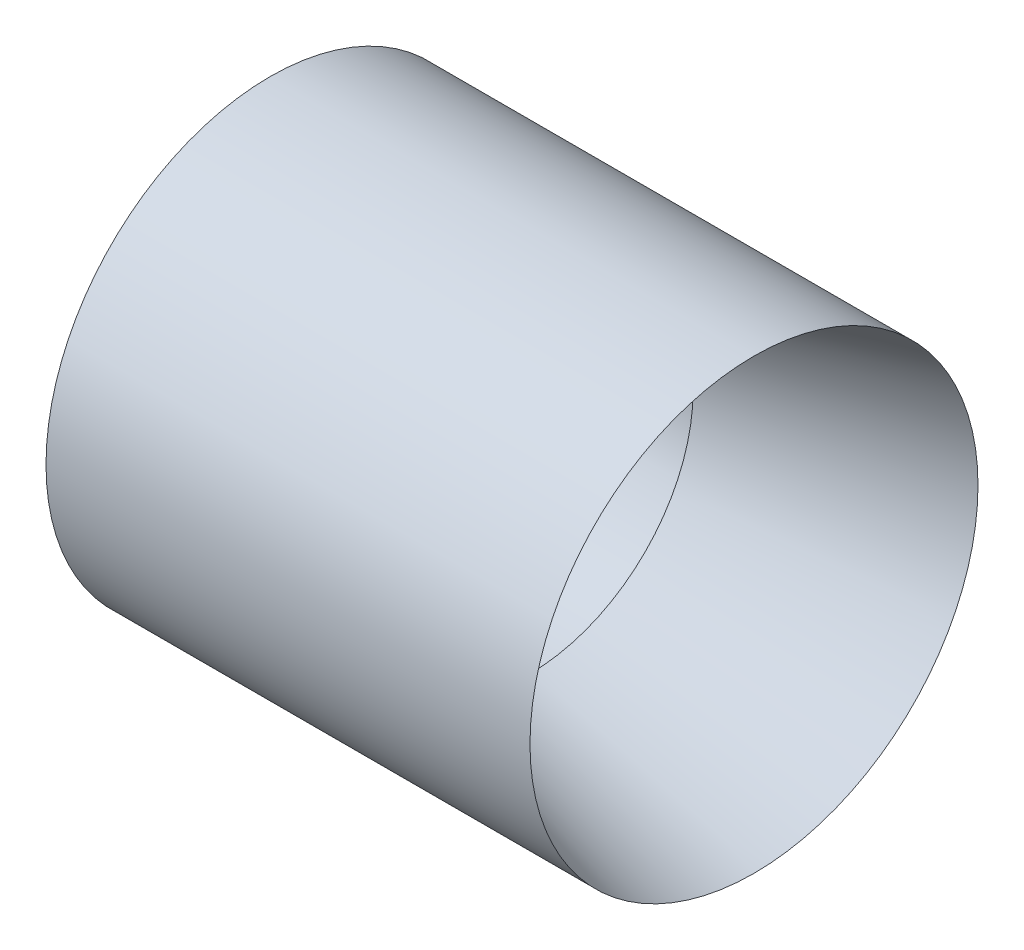
ISO-10303-21;
HEADER;
FILE_DESCRIPTION(('STEP AP214'),'2;1');
FILE_NAME('part.step','',(''),(''),'','','');
FILE_SCHEMA(('AUTOMOTIVE_DESIGN { 1 0 10303 214 1 1 1 1 }'));
ENDSEC;
DATA;
#1=APPLICATION_CONTEXT('core data for automotive mechanical design processes');
#2=APPLICATION_PROTOCOL_DEFINITION('international standard','automotive_design',2000,#1);
#3=PRODUCT_CONTEXT('',#1,'mechanical');
#4=PRODUCT('Part','Part','',(#3));
#5=PRODUCT_RELATED_PRODUCT_CATEGORY('part','',(#4));
#6=PRODUCT_DEFINITION_FORMATION('','',#4);
#7=PRODUCT_DEFINITION_CONTEXT('part definition',#1,'design');
#8=PRODUCT_DEFINITION('design','',#6,#7);
#9=PRODUCT_DEFINITION_SHAPE('','',#8);
#10=(LENGTH_UNIT() NAMED_UNIT(*) SI_UNIT(.MILLI.,.METRE.));
#11=(NAMED_UNIT(*) PLANE_ANGLE_UNIT() SI_UNIT($,.RADIAN.));
#12=(NAMED_UNIT(*) SI_UNIT($,.STERADIAN.) SOLID_ANGLE_UNIT());
#13=UNCERTAINTY_MEASURE_WITH_UNIT(LENGTH_MEASURE(1.E-05),#10,'distance_accuracy_value','');
#14=(GEOMETRIC_REPRESENTATION_CONTEXT(3) GLOBAL_UNCERTAINTY_ASSIGNED_CONTEXT((#13)) GLOBAL_UNIT_ASSIGNED_CONTEXT((#10,
#11,#12)) REPRESENTATION_CONTEXT('',''));
#15=CARTESIAN_POINT('',(0.,0.,0.));
#16=DIRECTION('',(0.,0.,1.));
#17=DIRECTION('',(1.,0.,0.));
#18=AXIS2_PLACEMENT_3D('',#15,#16,#17);
#19=CARTESIAN_POINT('',(160.657513694365,0.,0.));
#20=DIRECTION('',(-1.,0.,0.));
#21=DIRECTION('',(0.,0.,1.));
#22=AXIS2_PLACEMENT_3D('',#19,#20,#21);
#23=CONICAL_SURFACE('',#22,26.05,0.610865238198009);
#24=CARTESIAN_POINT('',(170.65454974156,0.,0.));
#25=DIRECTION('',(-1.,0.,0.));
#26=DIRECTION('',(0.,0.,1.));
#27=AXIS2_PLACEMENT_3D('',#24,#25,#26);
#28=CIRCLE('',#27,19.05);
#29=CARTESIAN_POINT('',(170.65454974156,0.,19.05));
#30=VERTEX_POINT('',#29);
#31=EDGE_CURVE('E10',#30,#30,#28,.T.);
#32=ORIENTED_EDGE('',*,*,#31,.F.);
#33=EDGE_LOOP('',(#32));
#34=FACE_BOUND('',#33,.T.);
#35=CARTESIAN_POINT('',(160.657513694365,0.,0.));
#36=DIRECTION('',(-1.,0.,0.));
#37=DIRECTION('',(0.,0.,1.));
#38=AXIS2_PLACEMENT_3D('',#35,#36,#37);
#39=CIRCLE('',#38,26.05);
#40=CARTESIAN_POINT('',(160.657513694365,0.,26.05));
#41=VERTEX_POINT('',#40);
#42=EDGE_CURVE('E51',#41,#41,#39,.T.);
#43=ORIENTED_EDGE('',*,*,#42,.T.);
#44=EDGE_LOOP('',(#43));
#45=FACE_BOUND('',#44,.T.);
#46=ADVANCED_FACE('F37',(#34,#45),#23,.F.);
#47=CARTESIAN_POINT('',(0.,0.,0.));
#48=DIRECTION('',(-1.,0.,0.));
#49=DIRECTION('',(0.,0.,1.));
#50=AXIS2_PLACEMENT_3D('',#47,#48,#49);
#51=CYLINDRICAL_SURFACE('',#50,19.05);
#52=CARTESIAN_POINT('',(190.812772909454,0.,0.));
#53=DIRECTION('',(-1.,0.,0.));
#54=DIRECTION('',(0.,0.,1.));
#55=AXIS2_PLACEMENT_3D('',#52,#53,#54);
#56=CIRCLE('',#55,19.05);
#57=CARTESIAN_POINT('',(190.812772909454,0.,19.05));
#58=VERTEX_POINT('',#57);
#59=EDGE_CURVE('E43',#58,#58,#56,.T.);
#60=ORIENTED_EDGE('',*,*,#59,.F.);
#61=EDGE_LOOP('',(#60));
#62=FACE_BOUND('',#61,.T.);
#63=ORIENTED_EDGE('',*,*,#31,.T.);
#64=EDGE_LOOP('',(#63));
#65=FACE_BOUND('',#64,.T.);
#66=ADVANCED_FACE('F66',(#62,#65),#51,.F.);
#67=CARTESIAN_POINT('',(190.812772909454,0.,0.));
#68=DIRECTION('',(1.,0.,0.));
#69=DIRECTION('',(0.,0.,-1.));
#70=AXIS2_PLACEMENT_3D('',#67,#68,#69);
#71=CONICAL_SURFACE('',#70,19.05,0.261799387798091);
#72=CARTESIAN_POINT('',(216.937128562496,0.,0.));
#73=DIRECTION('',(-1.,0.,0.));
#74=DIRECTION('',(0.,0.,1.));
#75=AXIS2_PLACEMENT_3D('',#72,#73,#74);
#76=CIRCLE('',#75,26.0499999999866);
#77=CARTESIAN_POINT('',(216.937128562496,0.,26.0499999999866));
#78=VERTEX_POINT('',#77);
#79=EDGE_CURVE('E47',#78,#78,#76,.T.);
#80=ORIENTED_EDGE('',*,*,#79,.F.);
#81=EDGE_LOOP('',(#80));
#82=FACE_BOUND('',#81,.T.);
#83=ORIENTED_EDGE('',*,*,#59,.T.);
#84=EDGE_LOOP('',(#83));
#85=FACE_BOUND('',#84,.T.);
#86=ADVANCED_FACE('F61',(#82,#85),#71,.F.);
#87=CARTESIAN_POINT('',(0.,0.,0.));
#88=DIRECTION('',(-1.,0.,0.));
#89=DIRECTION('',(0.,0.,1.));
#90=AXIS2_PLACEMENT_3D('',#87,#88,#89);
#91=CYLINDRICAL_SURFACE('',#90,26.0499999999933);
#92=ORIENTED_EDGE('',*,*,#42,.F.);
#93=EDGE_LOOP('',(#92));
#94=FACE_BOUND('',#93,.T.);
#95=ORIENTED_EDGE('',*,*,#79,.T.);
#96=EDGE_LOOP('',(#95));
#97=FACE_BOUND('',#96,.T.);
#98=ADVANCED_FACE('F58',(#94,#97),#91,.T.);
#99=CLOSED_SHELL('',(#46,#66,#86,#98));
#100=MANIFOLD_SOLID_BREP('B2',#99);
#101=ADVANCED_BREP_SHAPE_REPRESENTATION('',(#18,#100),#14);
#102=SHAPE_DEFINITION_REPRESENTATION(#9,#101);
ENDSEC;
END-ISO-10303-21;
